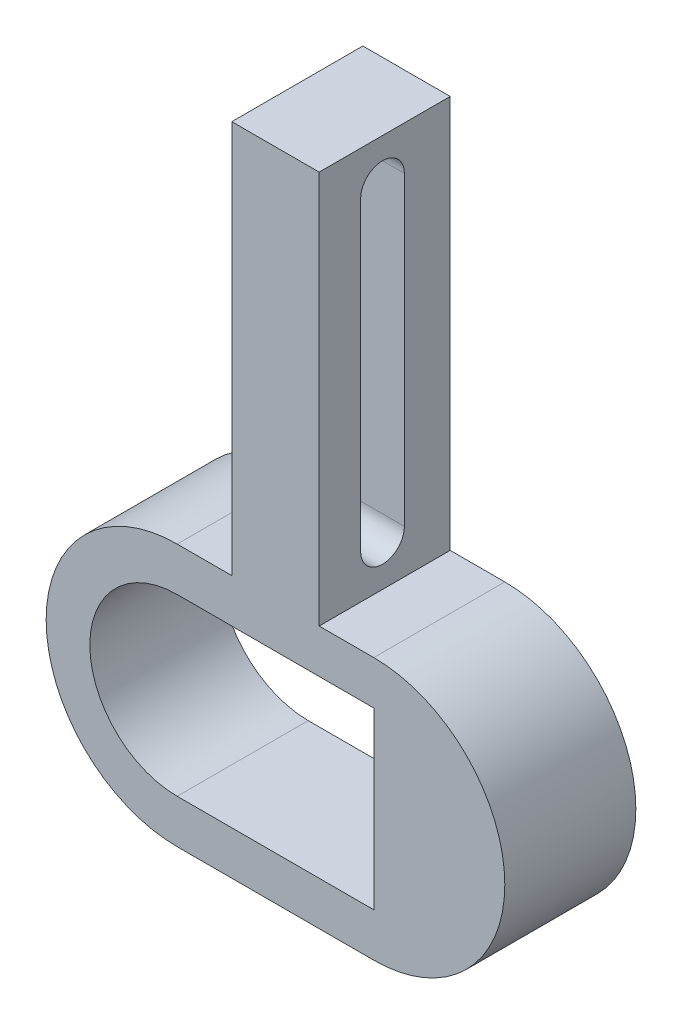
ISO-10303-21;
HEADER;
FILE_DESCRIPTION(('STEP AP214'),'2;1');
FILE_NAME('part.step','',(''),(''),'','','');
FILE_SCHEMA(('AUTOMOTIVE_DESIGN { 1 0 10303 214 1 1 1 1 }'));
ENDSEC;
DATA;
#1=APPLICATION_CONTEXT('core data for automotive mechanical design processes');
#2=APPLICATION_PROTOCOL_DEFINITION('international standard','automotive_design',2000,#1);
#3=PRODUCT_CONTEXT('',#1,'mechanical');
#4=PRODUCT('Part','Part','',(#3));
#5=PRODUCT_RELATED_PRODUCT_CATEGORY('part','',(#4));
#6=PRODUCT_DEFINITION_FORMATION('','',#4);
#7=PRODUCT_DEFINITION_CONTEXT('part definition',#1,'design');
#8=PRODUCT_DEFINITION('design','',#6,#7);
#9=PRODUCT_DEFINITION_SHAPE('','',#8);
#10=(LENGTH_UNIT() NAMED_UNIT(*) SI_UNIT(.MILLI.,.METRE.));
#11=(NAMED_UNIT(*) PLANE_ANGLE_UNIT() SI_UNIT($,.RADIAN.));
#12=(NAMED_UNIT(*) SI_UNIT($,.STERADIAN.) SOLID_ANGLE_UNIT());
#13=UNCERTAINTY_MEASURE_WITH_UNIT(LENGTH_MEASURE(1.E-05),#10,'distance_accuracy_value','');
#14=(GEOMETRIC_REPRESENTATION_CONTEXT(3) GLOBAL_UNCERTAINTY_ASSIGNED_CONTEXT((#13)) GLOBAL_UNIT_ASSIGNED_CONTEXT((#10,
#11,#12)) REPRESENTATION_CONTEXT('',''));
#15=CARTESIAN_POINT('',(0.,0.,0.));
#16=DIRECTION('',(0.,0.,1.));
#17=DIRECTION('',(1.,0.,0.));
#18=AXIS2_PLACEMENT_3D('',#15,#16,#17);
#19=CARTESIAN_POINT('',(32.5,-120.,30.));
#20=DIRECTION('',(0.,0.,1.));
#21=DIRECTION('',(1.,0.,0.));
#22=AXIS2_PLACEMENT_3D('',#19,#20,#21);
#23=PLANE('',#22);
#24=DIRECTION('',(0.,-1.,0.));
#25=VECTOR('',#24,1.);
#26=CARTESIAN_POINT('',(0.,-90.,30.));
#27=LINE('',#26,#25);
#28=CARTESIAN_POINT('',(0.,0.,30.));
#29=VERTEX_POINT('',#28);
#30=CARTESIAN_POINT('',(0.,-90.,30.));
#31=VERTEX_POINT('',#30);
#32=EDGE_CURVE('E215',#29,#31,#27,.T.);
#33=ORIENTED_EDGE('',*,*,#32,.T.);
#34=DIRECTION('',(-1.,0.,0.));
#35=VECTOR('',#34,1.);
#36=CARTESIAN_POINT('',(-12.5000000000001,-90.,30.));
#37=LINE('',#36,#35);
#38=CARTESIAN_POINT('',(-12.5000000000001,-90.,30.));
#39=VERTEX_POINT('',#38);
#40=EDGE_CURVE('E218',#31,#39,#37,.T.);
#41=ORIENTED_EDGE('',*,*,#40,.T.);
#42=CARTESIAN_POINT('',(-12.5,-120.,30.));
#43=DIRECTION('',(0.,0.,1.));
#44=DIRECTION('',(1.,0.,0.));
#45=AXIS2_PLACEMENT_3D('',#42,#43,#44);
#46=CIRCLE('',#45,30.);
#47=CARTESIAN_POINT('',(-12.4999999999997,-150.,30.));
#48=VERTEX_POINT('',#47);
#49=EDGE_CURVE('E221',#39,#48,#46,.T.);
#50=ORIENTED_EDGE('',*,*,#49,.T.);
#51=DIRECTION('',(1.,0.,0.));
#52=VECTOR('',#51,1.);
#53=CARTESIAN_POINT('',(-12.4999999999997,-150.,30.));
#54=LINE('',#53,#52);
#55=CARTESIAN_POINT('',(32.5000000000003,-150.,30.));
#56=VERTEX_POINT('',#55);
#57=EDGE_CURVE('E223',#48,#56,#54,.T.);
#58=ORIENTED_EDGE('',*,*,#57,.T.);
#59=CARTESIAN_POINT('',(32.5,-120.,30.));
#60=DIRECTION('',(0.,0.,1.));
#61=DIRECTION('',(1.,0.,0.));
#62=AXIS2_PLACEMENT_3D('',#59,#60,#61);
#63=CIRCLE('',#62,30.);
#64=CARTESIAN_POINT('',(32.4999999999999,-90.,30.));
#65=VERTEX_POINT('',#64);
#66=EDGE_CURVE('E225',#56,#65,#63,.T.);
#67=ORIENTED_EDGE('',*,*,#66,.T.);
#68=DIRECTION('',(-1.,0.,0.));
#69=VECTOR('',#68,1.);
#70=CARTESIAN_POINT('',(20.,-90.,30.));
#71=LINE('',#70,#69);
#72=CARTESIAN_POINT('',(20.,-90.,30.));
#73=VERTEX_POINT('',#72);
#74=EDGE_CURVE('E227',#65,#73,#71,.T.);
#75=ORIENTED_EDGE('',*,*,#74,.T.);
#76=DIRECTION('',(0.,1.,0.));
#77=VECTOR('',#76,1.);
#78=CARTESIAN_POINT('',(20.,0.,30.));
#79=LINE('',#78,#77);
#80=CARTESIAN_POINT('',(20.,0.,30.));
#81=VERTEX_POINT('',#80);
#82=EDGE_CURVE('E229',#73,#81,#79,.T.);
#83=ORIENTED_EDGE('',*,*,#82,.T.);
#84=DIRECTION('',(-1.,0.,0.));
#85=VECTOR('',#84,1.);
#86=CARTESIAN_POINT('',(0.,0.,30.));
#87=LINE('',#86,#85);
#88=EDGE_CURVE('E231',#81,#29,#87,.T.);
#89=ORIENTED_EDGE('',*,*,#88,.T.);
#90=EDGE_LOOP('',(#33,#41,#50,#58,#67,#75,#83,#89));
#91=FACE_BOUND('',#90,.T.);
#92=DIRECTION('',(1.,0.,0.));
#93=VECTOR('',#92,1.);
#94=CARTESIAN_POINT('',(32.5,-140.,30.));
#95=LINE('',#94,#93);
#96=CARTESIAN_POINT('',(-12.5,-140.,30.));
#97=VERTEX_POINT('',#96);
#98=CARTESIAN_POINT('',(32.5,-140.,30.));
#99=VERTEX_POINT('',#98);
#100=EDGE_CURVE('E186',#97,#99,#95,.T.);
#101=ORIENTED_EDGE('',*,*,#100,.F.);
#102=CARTESIAN_POINT('',(-12.5,-120.,30.));
#103=DIRECTION('',(0.,0.,1.));
#104=DIRECTION('',(1.,0.,0.));
#105=AXIS2_PLACEMENT_3D('',#102,#103,#104);
#106=CIRCLE('',#105,20.);
#107=CARTESIAN_POINT('',(-12.5,-100.,30.));
#108=VERTEX_POINT('',#107);
#109=EDGE_CURVE('E184',#108,#97,#106,.T.);
#110=ORIENTED_EDGE('',*,*,#109,.F.);
#111=DIRECTION('',(-1.,0.,0.));
#112=VECTOR('',#111,1.);
#113=CARTESIAN_POINT('',(32.5,-100.,30.));
#114=LINE('',#113,#112);
#115=CARTESIAN_POINT('',(32.5,-100.,30.));
#116=VERTEX_POINT('',#115);
#117=EDGE_CURVE('E192',#116,#108,#114,.T.);
#118=ORIENTED_EDGE('',*,*,#117,.F.);
#119=DIRECTION('',(0.,1.,0.));
#120=VECTOR('',#119,1.);
#121=CARTESIAN_POINT('',(32.5,-140.,30.));
#122=LINE('',#121,#120);
#123=EDGE_CURVE('E189',#99,#116,#122,.T.);
#124=ORIENTED_EDGE('',*,*,#123,.F.);
#125=EDGE_LOOP('',(#101,#110,#118,#124));
#126=FACE_BOUND('',#125,.T.);
#127=ADVANCED_FACE('F33',(#91,#126),#23,.T.);
#128=CARTESIAN_POINT('',(32.5,-120.,0.));
#129=DIRECTION('',(0.,0.,1.));
#130=DIRECTION('',(1.,0.,0.));
#131=AXIS2_PLACEMENT_3D('',#128,#129,#130);
#132=PLANE('',#131);
#133=DIRECTION('',(0.,-1.,0.));
#134=VECTOR('',#133,1.);
#135=CARTESIAN_POINT('',(0.,-90.,0.));
#136=LINE('',#135,#134);
#137=CARTESIAN_POINT('',(0.,0.,0.));
#138=VERTEX_POINT('',#137);
#139=CARTESIAN_POINT('',(0.,-90.,0.));
#140=VERTEX_POINT('',#139);
#141=EDGE_CURVE('E214',#138,#140,#136,.T.);
#142=ORIENTED_EDGE('',*,*,#141,.F.);
#143=DIRECTION('',(-1.,0.,0.));
#144=VECTOR('',#143,1.);
#145=CARTESIAN_POINT('',(0.,0.,0.));
#146=LINE('',#145,#144);
#147=CARTESIAN_POINT('',(20.,0.,0.));
#148=VERTEX_POINT('',#147);
#149=EDGE_CURVE('E219',#148,#138,#146,.T.);
#150=ORIENTED_EDGE('',*,*,#149,.F.);
#151=DIRECTION('',(0.,1.,0.));
#152=VECTOR('',#151,1.);
#153=CARTESIAN_POINT('',(20.,0.,0.));
#154=LINE('',#153,#152);
#155=CARTESIAN_POINT('',(20.,-90.,0.));
#156=VERTEX_POINT('',#155);
#157=EDGE_CURVE('E246',#156,#148,#154,.T.);
#158=ORIENTED_EDGE('',*,*,#157,.F.);
#159=DIRECTION('',(-1.,0.,0.));
#160=VECTOR('',#159,1.);
#161=CARTESIAN_POINT('',(20.,-90.,0.));
#162=LINE('',#161,#160);
#163=CARTESIAN_POINT('',(32.4999999999999,-90.,0.));
#164=VERTEX_POINT('',#163);
#165=EDGE_CURVE('E244',#164,#156,#162,.T.);
#166=ORIENTED_EDGE('',*,*,#165,.F.);
#167=CARTESIAN_POINT('',(32.5,-120.,0.));
#168=DIRECTION('',(0.,0.,1.));
#169=DIRECTION('',(1.,0.,0.));
#170=AXIS2_PLACEMENT_3D('',#167,#168,#169);
#171=CIRCLE('',#170,30.);
#172=CARTESIAN_POINT('',(32.5000000000003,-150.,0.));
#173=VERTEX_POINT('',#172);
#174=EDGE_CURVE('E242',#173,#164,#171,.T.);
#175=ORIENTED_EDGE('',*,*,#174,.F.);
#176=DIRECTION('',(1.,0.,0.));
#177=VECTOR('',#176,1.);
#178=CARTESIAN_POINT('',(-12.4999999999997,-150.,0.));
#179=LINE('',#178,#177);
#180=CARTESIAN_POINT('',(-12.4999999999997,-150.,0.));
#181=VERTEX_POINT('',#180);
#182=EDGE_CURVE('E240',#181,#173,#179,.T.);
#183=ORIENTED_EDGE('',*,*,#182,.F.);
#184=CARTESIAN_POINT('',(-12.5,-120.,0.));
#185=DIRECTION('',(0.,0.,1.));
#186=DIRECTION('',(1.,0.,0.));
#187=AXIS2_PLACEMENT_3D('',#184,#185,#186);
#188=CIRCLE('',#187,30.);
#189=CARTESIAN_POINT('',(-12.5000000000001,-90.,0.));
#190=VERTEX_POINT('',#189);
#191=EDGE_CURVE('E238',#190,#181,#188,.T.);
#192=ORIENTED_EDGE('',*,*,#191,.F.);
#193=DIRECTION('',(-1.,0.,0.));
#194=VECTOR('',#193,1.);
#195=CARTESIAN_POINT('',(-12.5000000000001,-90.,0.));
#196=LINE('',#195,#194);
#197=EDGE_CURVE('E236',#140,#190,#196,.T.);
#198=ORIENTED_EDGE('',*,*,#197,.F.);
#199=EDGE_LOOP('',(#142,#150,#158,#166,#175,#183,#192,#198));
#200=FACE_BOUND('',#199,.T.);
#201=CARTESIAN_POINT('',(-12.5,-120.,0.));
#202=DIRECTION('',(0.,0.,1.));
#203=DIRECTION('',(1.,0.,0.));
#204=AXIS2_PLACEMENT_3D('',#201,#202,#203);
#205=CIRCLE('',#204,20.);
#206=CARTESIAN_POINT('',(-12.5,-100.,0.));
#207=VERTEX_POINT('',#206);
#208=CARTESIAN_POINT('',(-12.5,-140.,0.));
#209=VERTEX_POINT('',#208);
#210=EDGE_CURVE('E183',#207,#209,#205,.T.);
#211=ORIENTED_EDGE('',*,*,#210,.T.);
#212=DIRECTION('',(1.,0.,0.));
#213=VECTOR('',#212,1.);
#214=CARTESIAN_POINT('',(32.5,-140.,0.));
#215=LINE('',#214,#213);
#216=CARTESIAN_POINT('',(32.5,-140.,0.));
#217=VERTEX_POINT('',#216);
#218=EDGE_CURVE('E197',#209,#217,#215,.T.);
#219=ORIENTED_EDGE('',*,*,#218,.T.);
#220=DIRECTION('',(0.,1.,0.));
#221=VECTOR('',#220,1.);
#222=CARTESIAN_POINT('',(32.5,-140.,0.));
#223=LINE('',#222,#221);
#224=CARTESIAN_POINT('',(32.5,-100.,0.));
#225=VERTEX_POINT('',#224);
#226=EDGE_CURVE('E200',#217,#225,#223,.T.);
#227=ORIENTED_EDGE('',*,*,#226,.T.);
#228=DIRECTION('',(-1.,0.,0.));
#229=VECTOR('',#228,1.);
#230=CARTESIAN_POINT('',(32.5,-100.,0.));
#231=LINE('',#230,#229);
#232=EDGE_CURVE('E187',#225,#207,#231,.T.);
#233=ORIENTED_EDGE('',*,*,#232,.T.);
#234=EDGE_LOOP('',(#211,#219,#227,#233));
#235=FACE_BOUND('',#234,.T.);
#236=ADVANCED_FACE('F276',(#200,#235),#132,.F.);
#237=CARTESIAN_POINT('',(0.,-90.,30.));
#238=DIRECTION('',(1.,0.,0.));
#239=DIRECTION('',(0.,0.,-1.));
#240=AXIS2_PLACEMENT_3D('',#237,#238,#239);
#241=PLANE('',#240);
#242=DIRECTION('',(0.,1.,0.));
#243=VECTOR('',#242,1.);
#244=CARTESIAN_POINT('',(0.,-90.,10.4978117666247));
#245=LINE('',#244,#243);
#246=CARTESIAN_POINT('',(0.,-80.,10.4978117666247));
#247=VERTEX_POINT('',#246);
#248=CARTESIAN_POINT('',(0.,-10.,10.4978117666247));
#249=VERTEX_POINT('',#248);
#250=EDGE_CURVE('E177',#247,#249,#245,.T.);
#251=ORIENTED_EDGE('',*,*,#250,.T.);
#252=CARTESIAN_POINT('',(0.,-10.,15.4978117666247));
#253=DIRECTION('',(1.,0.,0.));
#254=DIRECTION('',(0.,0.,-1.));
#255=AXIS2_PLACEMENT_3D('',#252,#253,#254);
#256=CIRCLE('',#255,5.);
#257=CARTESIAN_POINT('',(0.,-10.,20.4978117666247));
#258=VERTEX_POINT('',#257);
#259=EDGE_CURVE('E180',#249,#258,#256,.T.);
#260=ORIENTED_EDGE('',*,*,#259,.T.);
#261=DIRECTION('',(0.,-1.,0.));
#262=VECTOR('',#261,1.);
#263=CARTESIAN_POINT('',(0.,-90.,20.4978117666247));
#264=LINE('',#263,#262);
#265=CARTESIAN_POINT('',(0.,-80.,20.4978117666247));
#266=VERTEX_POINT('',#265);
#267=EDGE_CURVE('E172',#258,#266,#264,.T.);
#268=ORIENTED_EDGE('',*,*,#267,.T.);
#269=CARTESIAN_POINT('',(0.,-80.,15.4978117666247));
#270=DIRECTION('',(1.,0.,0.));
#271=DIRECTION('',(0.,0.,-1.));
#272=AXIS2_PLACEMENT_3D('',#269,#270,#271);
#273=CIRCLE('',#272,5.);
#274=EDGE_CURVE('E152',#266,#247,#273,.T.);
#275=ORIENTED_EDGE('',*,*,#274,.T.);
#276=EDGE_LOOP('',(#251,#260,#268,#275));
#277=FACE_BOUND('',#276,.T.);
#278=ORIENTED_EDGE('',*,*,#141,.T.);
#279=DIRECTION('',(0.,0.,-1.));
#280=VECTOR('',#279,1.);
#281=CARTESIAN_POINT('',(0.,-90.,30.));
#282=LINE('',#281,#280);
#283=EDGE_CURVE('E11',#31,#140,#282,.T.);
#284=ORIENTED_EDGE('',*,*,#283,.F.);
#285=ORIENTED_EDGE('',*,*,#32,.F.);
#286=DIRECTION('',(0.,0.,-1.));
#287=VECTOR('',#286,1.);
#288=CARTESIAN_POINT('',(0.,0.,30.));
#289=LINE('',#288,#287);
#290=EDGE_CURVE('E233',#29,#138,#289,.T.);
#291=ORIENTED_EDGE('',*,*,#290,.T.);
#292=EDGE_LOOP('',(#278,#284,#285,#291));
#293=FACE_BOUND('',#292,.T.);
#294=ADVANCED_FACE('F35',(#277,#293),#241,.F.);
#295=CARTESIAN_POINT('',(-12.5000000000001,-90.,30.));
#296=DIRECTION('',(0.,-1.,0.));
#297=DIRECTION('',(0.,0.,-1.));
#298=AXIS2_PLACEMENT_3D('',#295,#296,#297);
#299=PLANE('',#298);
#300=ORIENTED_EDGE('',*,*,#197,.T.);
#301=DIRECTION('',(0.,0.,-1.));
#302=VECTOR('',#301,1.);
#303=CARTESIAN_POINT('',(-12.5000000000001,-90.,30.));
#304=LINE('',#303,#302);
#305=EDGE_CURVE('E41',#39,#190,#304,.T.);
#306=ORIENTED_EDGE('',*,*,#305,.F.);
#307=ORIENTED_EDGE('',*,*,#40,.F.);
#308=ORIENTED_EDGE('',*,*,#283,.T.);
#309=EDGE_LOOP('',(#300,#306,#307,#308));
#310=FACE_BOUND('',#309,.T.);
#311=ADVANCED_FACE('F294',(#310),#299,.F.);
#312=CARTESIAN_POINT('',(-12.5,-120.,30.));
#313=DIRECTION('',(0.,0.,-1.));
#314=DIRECTION('',(-1.,0.,0.));
#315=AXIS2_PLACEMENT_3D('',#312,#313,#314);
#316=CYLINDRICAL_SURFACE('',#315,30.);
#317=ORIENTED_EDGE('',*,*,#191,.T.);
#318=DIRECTION('',(0.,0.,-1.));
#319=VECTOR('',#318,1.);
#320=CARTESIAN_POINT('',(-12.4999999999997,-150.,30.));
#321=LINE('',#320,#319);
#322=EDGE_CURVE('E263',#48,#181,#321,.T.);
#323=ORIENTED_EDGE('',*,*,#322,.F.);
#324=ORIENTED_EDGE('',*,*,#49,.F.);
#325=ORIENTED_EDGE('',*,*,#305,.T.);
#326=EDGE_LOOP('',(#317,#323,#324,#325));
#327=FACE_BOUND('',#326,.T.);
#328=ADVANCED_FACE('F270',(#327),#316,.T.);
#329=CARTESIAN_POINT('',(-12.4999999999997,-150.,30.));
#330=DIRECTION('',(0.,1.,0.));
#331=DIRECTION('',(0.,0.,1.));
#332=AXIS2_PLACEMENT_3D('',#329,#330,#331);
#333=PLANE('',#332);
#334=ORIENTED_EDGE('',*,*,#182,.T.);
#335=DIRECTION('',(0.,0.,-1.));
#336=VECTOR('',#335,1.);
#337=CARTESIAN_POINT('',(32.5000000000003,-150.,30.));
#338=LINE('',#337,#336);
#339=EDGE_CURVE('E260',#56,#173,#338,.T.);
#340=ORIENTED_EDGE('',*,*,#339,.F.);
#341=ORIENTED_EDGE('',*,*,#57,.F.);
#342=ORIENTED_EDGE('',*,*,#322,.T.);
#343=EDGE_LOOP('',(#334,#340,#341,#342));
#344=FACE_BOUND('',#343,.T.);
#345=ADVANCED_FACE('F282',(#344),#333,.F.);
#346=CARTESIAN_POINT('',(32.5,-120.,30.));
#347=DIRECTION('',(0.,0.,-1.));
#348=DIRECTION('',(-1.,0.,0.));
#349=AXIS2_PLACEMENT_3D('',#346,#347,#348);
#350=CYLINDRICAL_SURFACE('',#349,30.);
#351=ORIENTED_EDGE('',*,*,#174,.T.);
#352=DIRECTION('',(0.,0.,-1.));
#353=VECTOR('',#352,1.);
#354=CARTESIAN_POINT('',(32.4999999999999,-90.,30.));
#355=LINE('',#354,#353);
#356=EDGE_CURVE('E257',#65,#164,#355,.T.);
#357=ORIENTED_EDGE('',*,*,#356,.F.);
#358=ORIENTED_EDGE('',*,*,#66,.F.);
#359=ORIENTED_EDGE('',*,*,#339,.T.);
#360=EDGE_LOOP('',(#351,#357,#358,#359));
#361=FACE_BOUND('',#360,.T.);
#362=ADVANCED_FACE('F286',(#361),#350,.T.);
#363=CARTESIAN_POINT('',(20.,-90.,30.));
#364=DIRECTION('',(0.,-1.,0.));
#365=DIRECTION('',(0.,0.,-1.));
#366=AXIS2_PLACEMENT_3D('',#363,#364,#365);
#367=PLANE('',#366);
#368=ORIENTED_EDGE('',*,*,#165,.T.);
#369=DIRECTION('',(0.,0.,-1.));
#370=VECTOR('',#369,1.);
#371=CARTESIAN_POINT('',(20.,-90.,30.));
#372=LINE('',#371,#370);
#373=EDGE_CURVE('E254',#73,#156,#372,.T.);
#374=ORIENTED_EDGE('',*,*,#373,.F.);
#375=ORIENTED_EDGE('',*,*,#74,.F.);
#376=ORIENTED_EDGE('',*,*,#356,.T.);
#377=EDGE_LOOP('',(#368,#374,#375,#376));
#378=FACE_BOUND('',#377,.T.);
#379=ADVANCED_FACE('F305',(#378),#367,.F.);
#380=CARTESIAN_POINT('',(20.,0.,30.));
#381=DIRECTION('',(-1.,0.,0.));
#382=DIRECTION('',(0.,-1.,0.));
#383=AXIS2_PLACEMENT_3D('',#380,#381,#382);
#384=PLANE('',#383);
#385=DIRECTION('',(0.,-1.,0.));
#386=VECTOR('',#385,1.);
#387=CARTESIAN_POINT('',(20.,-10.,20.4978117666247));
#388=LINE('',#387,#386);
#389=CARTESIAN_POINT('',(20.,-10.,20.4978117666247));
#390=VERTEX_POINT('',#389);
#391=CARTESIAN_POINT('',(20.,-80.,20.4978117666247));
#392=VERTEX_POINT('',#391);
#393=EDGE_CURVE('E158',#390,#392,#388,.T.);
#394=ORIENTED_EDGE('',*,*,#393,.F.);
#395=CARTESIAN_POINT('',(20.,-10.,15.4978117666247));
#396=DIRECTION('',(1.,0.,0.));
#397=DIRECTION('',(0.,1.,0.));
#398=AXIS2_PLACEMENT_3D('',#395,#396,#397);
#399=CIRCLE('',#398,5.);
#400=CARTESIAN_POINT('',(20.,-10.,10.4978117666247));
#401=VERTEX_POINT('',#400);
#402=EDGE_CURVE('E56',#401,#390,#399,.T.);
#403=ORIENTED_EDGE('',*,*,#402,.F.);
#404=DIRECTION('',(0.,1.,0.));
#405=VECTOR('',#404,1.);
#406=CARTESIAN_POINT('',(20.,-10.,10.4978117666247));
#407=LINE('',#406,#405);
#408=CARTESIAN_POINT('',(20.,-80.,10.4978117666247));
#409=VERTEX_POINT('',#408);
#410=EDGE_CURVE('E165',#409,#401,#407,.T.);
#411=ORIENTED_EDGE('',*,*,#410,.F.);
#412=CARTESIAN_POINT('',(20.,-80.,15.4978117666247));
#413=DIRECTION('',(1.,0.,0.));
#414=DIRECTION('',(0.,1.,0.));
#415=AXIS2_PLACEMENT_3D('',#412,#413,#414);
#416=CIRCLE('',#415,5.);
#417=EDGE_CURVE('E149',#392,#409,#416,.T.);
#418=ORIENTED_EDGE('',*,*,#417,.F.);
#419=EDGE_LOOP('',(#394,#403,#411,#418));
#420=FACE_BOUND('',#419,.T.);
#421=ORIENTED_EDGE('',*,*,#157,.T.);
#422=DIRECTION('',(0.,0.,-1.));
#423=VECTOR('',#422,1.);
#424=CARTESIAN_POINT('',(20.,0.,30.));
#425=LINE('',#424,#423);
#426=EDGE_CURVE('E251',#81,#148,#425,.T.);
#427=ORIENTED_EDGE('',*,*,#426,.F.);
#428=ORIENTED_EDGE('',*,*,#82,.F.);
#429=ORIENTED_EDGE('',*,*,#373,.T.);
#430=EDGE_LOOP('',(#421,#427,#428,#429));
#431=FACE_BOUND('',#430,.T.);
#432=ADVANCED_FACE('F162',(#420,#431),#384,.F.);
#433=CARTESIAN_POINT('',(0.,0.,30.));
#434=DIRECTION('',(0.,-1.,0.));
#435=DIRECTION('',(0.,0.,-1.));
#436=AXIS2_PLACEMENT_3D('',#433,#434,#435);
#437=PLANE('',#436);
#438=ORIENTED_EDGE('',*,*,#149,.T.);
#439=ORIENTED_EDGE('',*,*,#290,.F.);
#440=ORIENTED_EDGE('',*,*,#88,.F.);
#441=ORIENTED_EDGE('',*,*,#426,.T.);
#442=EDGE_LOOP('',(#438,#439,#440,#441));
#443=FACE_BOUND('',#442,.T.);
#444=ADVANCED_FACE('F300',(#443),#437,.F.);
#445=CARTESIAN_POINT('',(-12.5,-120.,30.));
#446=DIRECTION('',(0.,0.,-1.));
#447=DIRECTION('',(-1.,0.,0.));
#448=AXIS2_PLACEMENT_3D('',#445,#446,#447);
#449=CYLINDRICAL_SURFACE('',#448,20.);
#450=ORIENTED_EDGE('',*,*,#210,.F.);
#451=DIRECTION('',(0.,0.,-1.));
#452=VECTOR('',#451,1.);
#453=CARTESIAN_POINT('',(-12.5,-100.,30.));
#454=LINE('',#453,#452);
#455=EDGE_CURVE('E194',#108,#207,#454,.T.);
#456=ORIENTED_EDGE('',*,*,#455,.F.);
#457=ORIENTED_EDGE('',*,*,#109,.T.);
#458=DIRECTION('',(0.,0.,-1.));
#459=VECTOR('',#458,1.);
#460=CARTESIAN_POINT('',(-12.5,-140.,30.));
#461=LINE('',#460,#459);
#462=EDGE_CURVE('E211',#97,#209,#461,.T.);
#463=ORIENTED_EDGE('',*,*,#462,.T.);
#464=EDGE_LOOP('',(#450,#456,#457,#463));
#465=FACE_BOUND('',#464,.T.);
#466=ADVANCED_FACE('F321',(#465),#449,.F.);
#467=CARTESIAN_POINT('',(32.5,-140.,30.));
#468=DIRECTION('',(0.,1.,0.));
#469=DIRECTION('',(0.,0.,1.));
#470=AXIS2_PLACEMENT_3D('',#467,#468,#469);
#471=PLANE('',#470);
#472=ORIENTED_EDGE('',*,*,#218,.F.);
#473=ORIENTED_EDGE('',*,*,#462,.F.);
#474=ORIENTED_EDGE('',*,*,#100,.T.);
#475=DIRECTION('',(0.,0.,-1.));
#476=VECTOR('',#475,1.);
#477=CARTESIAN_POINT('',(32.5,-140.,30.));
#478=LINE('',#477,#476);
#479=EDGE_CURVE('E209',#99,#217,#478,.T.);
#480=ORIENTED_EDGE('',*,*,#479,.T.);
#481=EDGE_LOOP('',(#472,#473,#474,#480));
#482=FACE_BOUND('',#481,.T.);
#483=ADVANCED_FACE('F328',(#482),#471,.T.);
#484=CARTESIAN_POINT('',(32.5,-140.,30.));
#485=DIRECTION('',(-1.,0.,0.));
#486=DIRECTION('',(0.,-1.,0.));
#487=AXIS2_PLACEMENT_3D('',#484,#485,#486);
#488=PLANE('',#487);
#489=ORIENTED_EDGE('',*,*,#226,.F.);
#490=ORIENTED_EDGE('',*,*,#479,.F.);
#491=ORIENTED_EDGE('',*,*,#123,.T.);
#492=DIRECTION('',(0.,0.,-1.));
#493=VECTOR('',#492,1.);
#494=CARTESIAN_POINT('',(32.5,-100.,30.));
#495=LINE('',#494,#493);
#496=EDGE_CURVE('E207',#116,#225,#495,.T.);
#497=ORIENTED_EDGE('',*,*,#496,.T.);
#498=EDGE_LOOP('',(#489,#490,#491,#497));
#499=FACE_BOUND('',#498,.T.);
#500=ADVANCED_FACE('F333',(#499),#488,.T.);
#501=CARTESIAN_POINT('',(32.5,-100.,30.));
#502=DIRECTION('',(0.,-1.,0.));
#503=DIRECTION('',(1.,0.,0.));
#504=AXIS2_PLACEMENT_3D('',#501,#502,#503);
#505=PLANE('',#504);
#506=ORIENTED_EDGE('',*,*,#232,.F.);
#507=ORIENTED_EDGE('',*,*,#496,.F.);
#508=ORIENTED_EDGE('',*,*,#117,.T.);
#509=ORIENTED_EDGE('',*,*,#455,.T.);
#510=EDGE_LOOP('',(#506,#507,#508,#509));
#511=FACE_BOUND('',#510,.T.);
#512=ADVANCED_FACE('F340',(#511),#505,.T.);
#513=CARTESIAN_POINT('',(-10.,-10.,15.4978117666247));
#514=DIRECTION('',(1.,0.,0.));
#515=DIRECTION('',(0.,1.,0.));
#516=AXIS2_PLACEMENT_3D('',#513,#514,#515);
#517=CYLINDRICAL_SURFACE('',#516,5.);
#518=DIRECTION('',(1.,0.,0.));
#519=VECTOR('',#518,1.);
#520=CARTESIAN_POINT('',(-10.,-10.,10.4978117666247));
#521=LINE('',#520,#519);
#522=EDGE_CURVE('E170',#249,#401,#521,.T.);
#523=ORIENTED_EDGE('',*,*,#522,.T.);
#524=ORIENTED_EDGE('',*,*,#402,.T.);
#525=DIRECTION('',(1.,0.,0.));
#526=VECTOR('',#525,1.);
#527=CARTESIAN_POINT('',(-10.,-10.,20.4978117666247));
#528=LINE('',#527,#526);
#529=EDGE_CURVE('E155',#258,#390,#528,.T.);
#530=ORIENTED_EDGE('',*,*,#529,.F.);
#531=ORIENTED_EDGE('',*,*,#259,.F.);
#532=EDGE_LOOP('',(#523,#524,#530,#531));
#533=FACE_BOUND('',#532,.T.);
#534=ADVANCED_FACE('F352',(#533),#517,.F.);
#535=CARTESIAN_POINT('',(-10.,-10.,10.4978117666247));
#536=DIRECTION('',(0.,0.,-1.));
#537=DIRECTION('',(0.,1.,0.));
#538=AXIS2_PLACEMENT_3D('',#535,#536,#537);
#539=PLANE('',#538);
#540=DIRECTION('',(1.,0.,0.));
#541=VECTOR('',#540,1.);
#542=CARTESIAN_POINT('',(-9.99999999999999,-80.,10.4978117666247));
#543=LINE('',#542,#541);
#544=EDGE_CURVE('E154',#247,#409,#543,.T.);
#545=ORIENTED_EDGE('',*,*,#544,.T.);
#546=ORIENTED_EDGE('',*,*,#410,.T.);
#547=ORIENTED_EDGE('',*,*,#522,.F.);
#548=ORIENTED_EDGE('',*,*,#250,.F.);
#549=EDGE_LOOP('',(#545,#546,#547,#548));
#550=FACE_BOUND('',#549,.T.);
#551=ADVANCED_FACE('F357',(#550),#539,.F.);
#552=CARTESIAN_POINT('',(-9.99999999999999,-80.,15.4978117666247));
#553=DIRECTION('',(1.,0.,0.));
#554=DIRECTION('',(0.,1.,0.));
#555=AXIS2_PLACEMENT_3D('',#552,#553,#554);
#556=CYLINDRICAL_SURFACE('',#555,5.);
#557=DIRECTION('',(1.,0.,0.));
#558=VECTOR('',#557,1.);
#559=CARTESIAN_POINT('',(-9.99999999999999,-80.,20.4978117666247));
#560=LINE('',#559,#558);
#561=EDGE_CURVE('E48',#266,#392,#560,.T.);
#562=ORIENTED_EDGE('',*,*,#561,.T.);
#563=ORIENTED_EDGE('',*,*,#417,.T.);
#564=ORIENTED_EDGE('',*,*,#544,.F.);
#565=ORIENTED_EDGE('',*,*,#274,.F.);
#566=EDGE_LOOP('',(#562,#563,#564,#565));
#567=FACE_BOUND('',#566,.T.);
#568=ADVANCED_FACE('F146',(#567),#556,.F.);
#569=CARTESIAN_POINT('',(-10.,-10.,20.4978117666247));
#570=DIRECTION('',(0.,0.,1.));
#571=DIRECTION('',(0.,-1.,0.));
#572=AXIS2_PLACEMENT_3D('',#569,#570,#571);
#573=PLANE('',#572);
#574=ORIENTED_EDGE('',*,*,#529,.T.);
#575=ORIENTED_EDGE('',*,*,#393,.T.);
#576=ORIENTED_EDGE('',*,*,#561,.F.);
#577=ORIENTED_EDGE('',*,*,#267,.F.);
#578=EDGE_LOOP('',(#574,#575,#576,#577));
#579=FACE_BOUND('',#578,.T.);
#580=ADVANCED_FACE('F159',(#579),#573,.F.);
#581=CLOSED_SHELL('',(#127,#236,#294,#311,#328,#345,#362,#379,#432,#444,#466,#483,#500,#512,
#534,#551,#568,#580));
#582=MANIFOLD_SOLID_BREP('B2',#581);
#583=ADVANCED_BREP_SHAPE_REPRESENTATION('',(#18,#582),#14);
#584=SHAPE_DEFINITION_REPRESENTATION(#9,#583);
ENDSEC;
END-ISO-10303-21;
